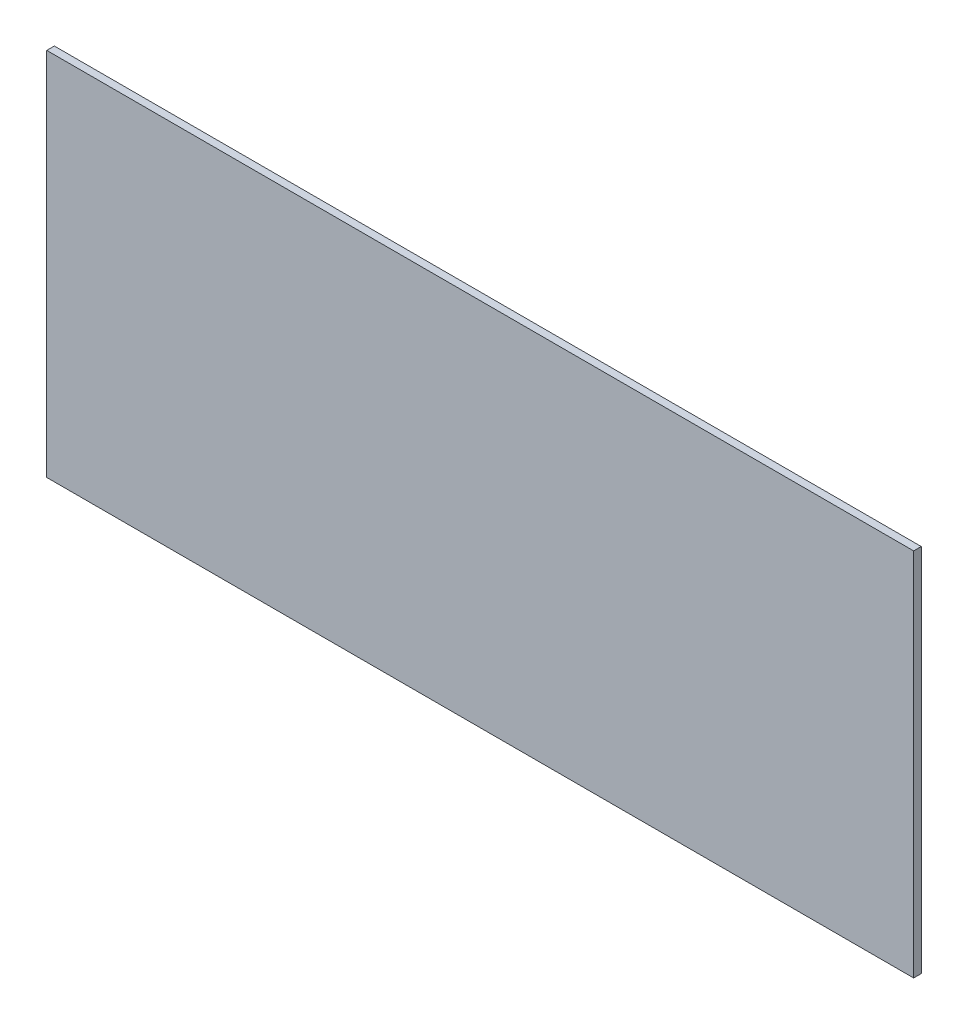
ISO-10303-21;
HEADER;
FILE_DESCRIPTION(('STEP AP214'),'2;1');
FILE_NAME('part.step','',(''),(''),'','','');
FILE_SCHEMA(('AUTOMOTIVE_DESIGN { 1 0 10303 214 1 1 1 1 }'));
ENDSEC;
DATA;
#1=APPLICATION_CONTEXT('core data for automotive mechanical design processes');
#2=APPLICATION_PROTOCOL_DEFINITION('international standard','automotive_design',2000,#1);
#3=PRODUCT_CONTEXT('',#1,'mechanical');
#4=PRODUCT('Part','Part','',(#3));
#5=PRODUCT_RELATED_PRODUCT_CATEGORY('part','',(#4));
#6=PRODUCT_DEFINITION_FORMATION('','',#4);
#7=PRODUCT_DEFINITION_CONTEXT('part definition',#1,'design');
#8=PRODUCT_DEFINITION('design','',#6,#7);
#9=PRODUCT_DEFINITION_SHAPE('','',#8);
#10=(LENGTH_UNIT() NAMED_UNIT(*) SI_UNIT(.MILLI.,.METRE.));
#11=(NAMED_UNIT(*) PLANE_ANGLE_UNIT() SI_UNIT($,.RADIAN.));
#12=(NAMED_UNIT(*) SI_UNIT($,.STERADIAN.) SOLID_ANGLE_UNIT());
#13=UNCERTAINTY_MEASURE_WITH_UNIT(LENGTH_MEASURE(1.E-05),#10,'distance_accuracy_value','');
#14=(GEOMETRIC_REPRESENTATION_CONTEXT(3) GLOBAL_UNCERTAINTY_ASSIGNED_CONTEXT((#13)) GLOBAL_UNIT_ASSIGNED_CONTEXT((#10,
#11,#12)) REPRESENTATION_CONTEXT('',''));
#15=CARTESIAN_POINT('',(0.,0.,0.));
#16=DIRECTION('',(0.,0.,1.));
#17=DIRECTION('',(1.,0.,0.));
#18=AXIS2_PLACEMENT_3D('',#15,#16,#17);
#19=CARTESIAN_POINT('',(-57.15,24.384,0.5));
#20=DIRECTION('',(1.,0.,0.));
#21=DIRECTION('',(0.,0.,-1.));
#22=AXIS2_PLACEMENT_3D('',#19,#20,#21);
#23=PLANE('',#22);
#24=DIRECTION('',(0.,-1.,0.));
#25=VECTOR('',#24,1.);
#26=CARTESIAN_POINT('',(-57.15,24.384,-0.5));
#27=LINE('',#26,#25);
#28=CARTESIAN_POINT('',(-57.15,24.384,-0.5));
#29=VERTEX_POINT('',#28);
#30=CARTESIAN_POINT('',(-57.15,-24.384,-0.5));
#31=VERTEX_POINT('',#30);
#32=EDGE_CURVE('E96',#29,#31,#27,.T.);
#33=ORIENTED_EDGE('',*,*,#32,.T.);
#34=DIRECTION('',(0.,0.,-1.));
#35=VECTOR('',#34,1.);
#36=CARTESIAN_POINT('',(-57.15,-24.384,0.5));
#37=LINE('',#36,#35);
#38=CARTESIAN_POINT('',(-57.15,-24.384,0.5));
#39=VERTEX_POINT('',#38);
#40=EDGE_CURVE('E11',#39,#31,#37,.T.);
#41=ORIENTED_EDGE('',*,*,#40,.F.);
#42=DIRECTION('',(0.,-1.,0.));
#43=VECTOR('',#42,1.);
#44=CARTESIAN_POINT('',(-57.15,24.384,0.5));
#45=LINE('',#44,#43);
#46=CARTESIAN_POINT('',(-57.15,24.384,0.5));
#47=VERTEX_POINT('',#46);
#48=EDGE_CURVE('E84',#47,#39,#45,.T.);
#49=ORIENTED_EDGE('',*,*,#48,.F.);
#50=DIRECTION('',(0.,0.,-1.));
#51=VECTOR('',#50,1.);
#52=CARTESIAN_POINT('',(-57.15,24.384,0.5));
#53=LINE('',#52,#51);
#54=EDGE_CURVE('E92',#47,#29,#53,.T.);
#55=ORIENTED_EDGE('',*,*,#54,.T.);
#56=EDGE_LOOP('',(#33,#41,#49,#55));
#57=FACE_BOUND('',#56,.T.);
#58=ADVANCED_FACE('F33',(#57),#23,.F.);
#59=CARTESIAN_POINT('',(-57.15,-24.384,0.5));
#60=DIRECTION('',(0.,1.,0.));
#61=DIRECTION('',(0.,0.,1.));
#62=AXIS2_PLACEMENT_3D('',#59,#60,#61);
#63=PLANE('',#62);
#64=DIRECTION('',(1.,0.,0.));
#65=VECTOR('',#64,1.);
#66=CARTESIAN_POINT('',(-57.15,-24.384,-0.5));
#67=LINE('',#66,#65);
#68=CARTESIAN_POINT('',(57.15,-24.384,-0.5));
#69=VERTEX_POINT('',#68);
#70=EDGE_CURVE('E88',#31,#69,#67,.T.);
#71=ORIENTED_EDGE('',*,*,#70,.T.);
#72=DIRECTION('',(0.,0.,-1.));
#73=VECTOR('',#72,1.);
#74=CARTESIAN_POINT('',(57.15,-24.384,0.5));
#75=LINE('',#74,#73);
#76=CARTESIAN_POINT('',(57.15,-24.384,0.5));
#77=VERTEX_POINT('',#76);
#78=EDGE_CURVE('E41',#77,#69,#75,.T.);
#79=ORIENTED_EDGE('',*,*,#78,.F.);
#80=DIRECTION('',(1.,0.,0.));
#81=VECTOR('',#80,1.);
#82=CARTESIAN_POINT('',(-57.15,-24.384,0.5));
#83=LINE('',#82,#81);
#84=EDGE_CURVE('E79',#39,#77,#83,.T.);
#85=ORIENTED_EDGE('',*,*,#84,.F.);
#86=ORIENTED_EDGE('',*,*,#40,.T.);
#87=EDGE_LOOP('',(#71,#79,#85,#86));
#88=FACE_BOUND('',#87,.T.);
#89=ADVANCED_FACE('F87',(#88),#63,.F.);
#90=CARTESIAN_POINT('',(57.15,24.384,0.5));
#91=DIRECTION('',(-1.,0.,0.));
#92=DIRECTION('',(0.,0.,1.));
#93=AXIS2_PLACEMENT_3D('',#90,#91,#92);
#94=PLANE('',#93);
#95=DIRECTION('',(0.,1.,0.));
#96=VECTOR('',#95,1.);
#97=CARTESIAN_POINT('',(57.15,24.384,-0.5));
#98=LINE('',#97,#96);
#99=CARTESIAN_POINT('',(57.15,24.384,-0.5));
#100=VERTEX_POINT('',#99);
#101=EDGE_CURVE('E66',#69,#100,#98,.T.);
#102=ORIENTED_EDGE('',*,*,#101,.T.);
#103=DIRECTION('',(0.,0.,-1.));
#104=VECTOR('',#103,1.);
#105=CARTESIAN_POINT('',(57.15,24.384,0.5));
#106=LINE('',#105,#104);
#107=CARTESIAN_POINT('',(57.15,24.384,0.5));
#108=VERTEX_POINT('',#107);
#109=EDGE_CURVE('E89',#108,#100,#106,.T.);
#110=ORIENTED_EDGE('',*,*,#109,.F.);
#111=DIRECTION('',(0.,1.,0.));
#112=VECTOR('',#111,1.);
#113=CARTESIAN_POINT('',(57.15,24.384,0.5));
#114=LINE('',#113,#112);
#115=EDGE_CURVE('E82',#77,#108,#114,.T.);
#116=ORIENTED_EDGE('',*,*,#115,.F.);
#117=ORIENTED_EDGE('',*,*,#78,.T.);
#118=EDGE_LOOP('',(#102,#110,#116,#117));
#119=FACE_BOUND('',#118,.T.);
#120=ADVANCED_FACE('F90',(#119),#94,.F.);
#121=CARTESIAN_POINT('',(-57.15,24.384,0.5));
#122=DIRECTION('',(0.,-1.,0.));
#123=DIRECTION('',(0.,0.,-1.));
#124=AXIS2_PLACEMENT_3D('',#121,#122,#123);
#125=PLANE('',#124);
#126=DIRECTION('',(-1.,0.,0.));
#127=VECTOR('',#126,1.);
#128=CARTESIAN_POINT('',(-57.15,24.384,-0.5));
#129=LINE('',#128,#127);
#130=EDGE_CURVE('E72',#100,#29,#129,.T.);
#131=ORIENTED_EDGE('',*,*,#130,.T.);
#132=ORIENTED_EDGE('',*,*,#54,.F.);
#133=DIRECTION('',(-1.,0.,0.));
#134=VECTOR('',#133,1.);
#135=CARTESIAN_POINT('',(-57.15,24.384,0.5));
#136=LINE('',#135,#134);
#137=EDGE_CURVE('E49',#108,#47,#136,.T.);
#138=ORIENTED_EDGE('',*,*,#137,.F.);
#139=ORIENTED_EDGE('',*,*,#109,.T.);
#140=EDGE_LOOP('',(#131,#132,#138,#139));
#141=FACE_BOUND('',#140,.T.);
#142=ADVANCED_FACE('F103',(#141),#125,.F.);
#143=CARTESIAN_POINT('',(0.,0.,0.5));
#144=DIRECTION('',(0.,0.,1.));
#145=DIRECTION('',(1.,0.,0.));
#146=AXIS2_PLACEMENT_3D('',#143,#144,#145);
#147=PLANE('',#146);
#148=ORIENTED_EDGE('',*,*,#48,.T.);
#149=ORIENTED_EDGE('',*,*,#84,.T.);
#150=ORIENTED_EDGE('',*,*,#115,.T.);
#151=ORIENTED_EDGE('',*,*,#137,.T.);
#152=EDGE_LOOP('',(#148,#149,#150,#151));
#153=FACE_BOUND('',#152,.T.);
#154=ADVANCED_FACE('F80',(#153),#147,.T.);
#155=CARTESIAN_POINT('',(0.,0.,-0.5));
#156=DIRECTION('',(0.,0.,1.));
#157=DIRECTION('',(1.,0.,0.));
#158=AXIS2_PLACEMENT_3D('',#155,#156,#157);
#159=PLANE('',#158);
#160=ORIENTED_EDGE('',*,*,#32,.F.);
#161=ORIENTED_EDGE('',*,*,#130,.F.);
#162=ORIENTED_EDGE('',*,*,#101,.F.);
#163=ORIENTED_EDGE('',*,*,#70,.F.);
#164=EDGE_LOOP('',(#160,#161,#162,#163));
#165=FACE_BOUND('',#164,.T.);
#166=ADVANCED_FACE('F106',(#165),#159,.F.);
#167=CLOSED_SHELL('',(#58,#89,#120,#142,#154,#166));
#168=MANIFOLD_SOLID_BREP('B2',#167);
#169=ADVANCED_BREP_SHAPE_REPRESENTATION('',(#18,#168),#14);
#170=SHAPE_DEFINITION_REPRESENTATION(#9,#169);
ENDSEC;
END-ISO-10303-21;
